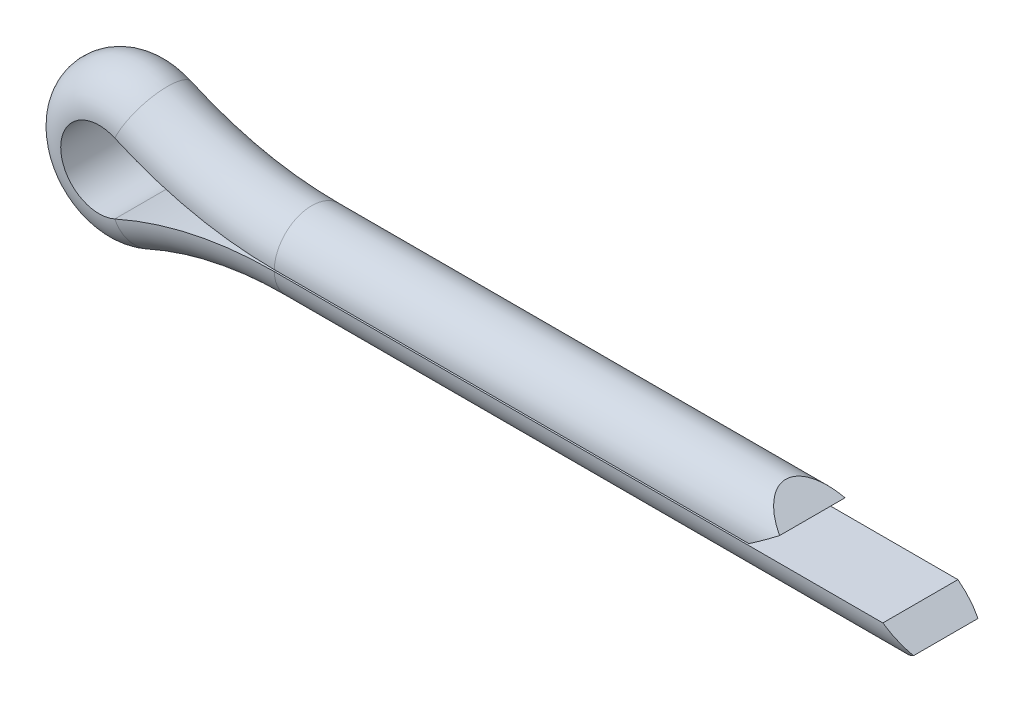
ISO-10303-21;
HEADER;
FILE_DESCRIPTION(('STEP AP214'),'2;1');
FILE_NAME('part.step','',(''),(''),'','','');
FILE_SCHEMA(('AUTOMOTIVE_DESIGN { 1 0 10303 214 1 1 1 1 }'));
ENDSEC;
DATA;
#1=APPLICATION_CONTEXT('core data for automotive mechanical design processes');
#2=APPLICATION_PROTOCOL_DEFINITION('international standard','automotive_design',2000,#1);
#3=PRODUCT_CONTEXT('',#1,'mechanical');
#4=PRODUCT('Part','Part','',(#3));
#5=PRODUCT_RELATED_PRODUCT_CATEGORY('part','',(#4));
#6=PRODUCT_DEFINITION_FORMATION('','',#4);
#7=PRODUCT_DEFINITION_CONTEXT('part definition',#1,'design');
#8=PRODUCT_DEFINITION('design','',#6,#7);
#9=PRODUCT_DEFINITION_SHAPE('','',#8);
#10=(LENGTH_UNIT() NAMED_UNIT(*) SI_UNIT(.MILLI.,.METRE.));
#11=(NAMED_UNIT(*) PLANE_ANGLE_UNIT() SI_UNIT($,.RADIAN.));
#12=(NAMED_UNIT(*) SI_UNIT($,.STERADIAN.) SOLID_ANGLE_UNIT());
#13=UNCERTAINTY_MEASURE_WITH_UNIT(LENGTH_MEASURE(1.E-05),#10,'distance_accuracy_value','');
#14=(GEOMETRIC_REPRESENTATION_CONTEXT(3) GLOBAL_UNCERTAINTY_ASSIGNED_CONTEXT((#13)) GLOBAL_UNIT_ASSIGNED_CONTEXT((#10,
#11,#12)) REPRESENTATION_CONTEXT('',''));
#15=CARTESIAN_POINT('',(0.,0.,0.));
#16=DIRECTION('',(0.,0.,1.));
#17=DIRECTION('',(1.,0.,0.));
#18=AXIS2_PLACEMENT_3D('',#15,#16,#17);
#19=CARTESIAN_POINT('',(2.10000000000001,0.,0.));
#20=DIRECTION('',(1.,0.,0.));
#21=DIRECTION('',(0.,1.,0.));
#22=AXIS2_PLACEMENT_3D('',#19,#20,#21);
#23=CYLINDRICAL_SURFACE('',#22,0.45);
#24=CARTESIAN_POINT('',(9.38216773617407,0.,0.));
#25=DIRECTION('',(-0.586251612404128,-0.81012903105219,0.));
#26=DIRECTION('',(0.81012903105219,-0.586251612404128,0.));
#27=AXIS2_PLACEMENT_3D('',#24,#25,#26);
#28=ELLIPSE('',#27,0.767588507184857,0.45);
#29=CARTESIAN_POINT('',(9.7,-0.23,-0.386781592116268));
#30=VERTEX_POINT('',#29);
#31=CARTESIAN_POINT('',(9.39598653025346,-0.0100000000000006,-0.44988887516808));
#32=VERTEX_POINT('',#31);
#33=EDGE_CURVE('E175',#30,#32,#28,.F.);
#34=ORIENTED_EDGE('',*,*,#33,.F.);
#35=CARTESIAN_POINT('',(10.0395995364447,0.,0.));
#36=DIRECTION('',(-0.560762411864817,0.827976761412754,0.));
#37=DIRECTION('',(0.827976761412754,0.560762411864818,0.));
#38=AXIS2_PLACEMENT_3D('',#35,#36,#37);
#39=ELLIPSE('',#38,0.802478893875079,0.45);
#40=CARTESIAN_POINT('',(9.7,-0.23,0.386781592116267));
#41=VERTEX_POINT('',#40);
#42=EDGE_CURVE('E171',#41,#30,#39,.F.);
#43=ORIENTED_EDGE('',*,*,#42,.F.);
#44=CARTESIAN_POINT('',(9.39598653025346,-0.0100000000000001,0.44988887516808));
#45=VERTEX_POINT('',#44);
#46=EDGE_CURVE('E118',#45,#41,#28,.F.);
#47=ORIENTED_EDGE('',*,*,#46,.F.);
#48=DIRECTION('',(1.,0.,0.));
#49=VECTOR('',#48,1.);
#50=CARTESIAN_POINT('',(2.10000000000001,-0.00999999999999997,0.44988887516808));
#51=LINE('',#50,#49);
#52=CARTESIAN_POINT('',(2.10000000000001,-0.00999999999999997,0.44988887516808));
#53=VERTEX_POINT('',#52);
#54=EDGE_CURVE('E46',#53,#45,#51,.T.);
#55=ORIENTED_EDGE('',*,*,#54,.F.);
#56=CARTESIAN_POINT('',(2.10000000000001,0.,0.));
#57=DIRECTION('',(1.,0.,0.));
#58=DIRECTION('',(0.,0.,1.));
#59=AXIS2_PLACEMENT_3D('',#56,#57,#58);
#60=CIRCLE('',#59,0.45);
#61=CARTESIAN_POINT('',(2.10000000000001,-0.00999999999999997,-0.44988887516808));
#62=VERTEX_POINT('',#61);
#63=EDGE_CURVE('E153',#53,#62,#60,.T.);
#64=ORIENTED_EDGE('',*,*,#63,.T.);
#65=DIRECTION('',(1.,0.,0.));
#66=VECTOR('',#65,1.);
#67=CARTESIAN_POINT('',(2.10000000000001,-0.00999999999999997,-0.44988887516808));
#68=LINE('',#67,#66);
#69=EDGE_CURVE('E11',#62,#32,#68,.T.);
#70=ORIENTED_EDGE('',*,*,#69,.T.);
#71=EDGE_LOOP('',(#34,#43,#47,#55,#64,#70));
#72=FACE_BOUND('',#71,.T.);
#73=ADVANCED_FACE('F38',(#72),#23,.T.);
#74=CARTESIAN_POINT('',(2.10000000000001,-0.00999999999999997,-0.44988887516808));
#75=DIRECTION('',(0.,1.,0.));
#76=DIRECTION('',(-1.,0.,0.));
#77=AXIS2_PLACEMENT_3D('',#74,#75,#76);
#78=PLANE('',#77);
#79=DIRECTION('',(0.,0.,1.));
#80=VECTOR('',#79,1.);
#81=CARTESIAN_POINT('',(9.39598653025346,-0.0100000000000001,-0.44988887516808));
#82=LINE('',#81,#80);
#83=EDGE_CURVE('E53',#32,#45,#82,.T.);
#84=ORIENTED_EDGE('',*,*,#83,.F.);
#85=ORIENTED_EDGE('',*,*,#69,.F.);
#86=DIRECTION('',(0.,0.,1.));
#87=VECTOR('',#86,1.);
#88=CARTESIAN_POINT('',(2.10000000000001,-0.00999999999999997,-0.44988887516808));
#89=LINE('',#88,#87);
#90=EDGE_CURVE('E156',#62,#53,#89,.T.);
#91=ORIENTED_EDGE('',*,*,#90,.T.);
#92=ORIENTED_EDGE('',*,*,#54,.T.);
#93=EDGE_LOOP('',(#84,#85,#91,#92));
#94=FACE_BOUND('',#93,.T.);
#95=ADVANCED_FACE('F40',(#94),#78,.T.);
#96=CARTESIAN_POINT('',(2.1,-4.675,0.));
#97=DIRECTION('',(0.,0.,-1.));
#98=DIRECTION('',(-1.,0.,0.));
#99=AXIS2_PLACEMENT_3D('',#96,#97,#98);
#100=CYLINDRICAL_SURFACE('',#99,4.665);
#101=DIRECTION('',(0.,0.,1.));
#102=VECTOR('',#101,1.);
#103=CARTESIAN_POINT('',(0.188487804878055,-0.419609756097559,-0.44988887516808));
#104=LINE('',#103,#102);
#105=CARTESIAN_POINT('',(0.188487804878055,-0.419609756097559,-0.44988887516808));
#106=VERTEX_POINT('',#105);
#107=CARTESIAN_POINT('',(0.188487804878055,-0.419609756097559,0.44988887516808));
#108=VERTEX_POINT('',#107);
#109=EDGE_CURVE('E144',#106,#108,#104,.T.);
#110=ORIENTED_EDGE('',*,*,#109,.T.);
#111=CARTESIAN_POINT('',(2.1,-4.675,0.44988887516808));
#112=DIRECTION('',(0.,0.,-1.));
#113=DIRECTION('',(-1.,0.,0.));
#114=AXIS2_PLACEMENT_3D('',#111,#112,#113);
#115=CIRCLE('',#114,4.665);
#116=EDGE_CURVE('E159',#108,#53,#115,.T.);
#117=ORIENTED_EDGE('',*,*,#116,.T.);
#118=ORIENTED_EDGE('',*,*,#90,.F.);
#119=CARTESIAN_POINT('',(2.1,-4.675,-0.44988887516808));
#120=DIRECTION('',(0.,0.,-1.));
#121=DIRECTION('',(-1.,0.,0.));
#122=AXIS2_PLACEMENT_3D('',#119,#120,#121);
#123=CIRCLE('',#122,4.665);
#124=EDGE_CURVE('E162',#106,#62,#123,.T.);
#125=ORIENTED_EDGE('',*,*,#124,.F.);
#126=EDGE_LOOP('',(#110,#117,#118,#125));
#127=FACE_BOUND('',#126,.T.);
#128=ADVANCED_FACE('F195',(#127),#100,.T.);
#129=CARTESIAN_POINT('',(2.1,-4.675,0.));
#130=DIRECTION('',(0.,0.,-1.));
#131=DIRECTION('',(-1.,0.,0.));
#132=AXIS2_PLACEMENT_3D('',#129,#130,#131);
#133=TOROIDAL_SURFACE('',#132,4.675,0.45);
#134=CARTESIAN_POINT('',(0.184390243902445,-0.410487804878047,0.));
#135=DIRECTION('',(0.912195121951213,0.409756097560989,0.));
#136=DIRECTION('',(0.,0.,1.));
#137=AXIS2_PLACEMENT_3D('',#134,#135,#136);
#138=CIRCLE('',#137,0.45);
#139=EDGE_CURVE('E141',#108,#106,#138,.T.);
#140=ORIENTED_EDGE('',*,*,#139,.T.);
#141=ORIENTED_EDGE('',*,*,#124,.T.);
#142=ORIENTED_EDGE('',*,*,#63,.F.);
#143=ORIENTED_EDGE('',*,*,#116,.F.);
#144=EDGE_LOOP('',(#140,#141,#142,#143));
#145=FACE_BOUND('',#144,.T.);
#146=ADVANCED_FACE('F197',(#145),#133,.T.);
#147=CARTESIAN_POINT('',(0.,0.,0.));
#148=DIRECTION('',(0.,0.,1.));
#149=DIRECTION('',(1.,0.,0.));
#150=AXIS2_PLACEMENT_3D('',#147,#148,#149);
#151=CYLINDRICAL_SURFACE('',#150,0.460000000000001);
#152=DIRECTION('',(0.,0.,1.));
#153=VECTOR('',#152,1.);
#154=CARTESIAN_POINT('',(0.18848780487805,0.419609756097561,-0.44988887516808));
#155=LINE('',#154,#153);
#156=CARTESIAN_POINT('',(0.18848780487805,0.419609756097561,-0.44988887516808));
#157=VERTEX_POINT('',#156);
#158=CARTESIAN_POINT('',(0.18848780487805,0.419609756097561,0.44988887516808));
#159=VERTEX_POINT('',#158);
#160=EDGE_CURVE('E128',#157,#159,#155,.T.);
#161=ORIENTED_EDGE('',*,*,#160,.T.);
#162=CARTESIAN_POINT('',(0.,0.,0.44988887516808));
#163=DIRECTION('',(0.,0.,1.));
#164=DIRECTION('',(1.,0.,0.));
#165=AXIS2_PLACEMENT_3D('',#162,#163,#164);
#166=CIRCLE('',#165,0.460000000000001);
#167=EDGE_CURVE('E147',#159,#108,#166,.T.);
#168=ORIENTED_EDGE('',*,*,#167,.T.);
#169=ORIENTED_EDGE('',*,*,#109,.F.);
#170=CARTESIAN_POINT('',(0.,0.,-0.44988887516808));
#171=DIRECTION('',(0.,0.,1.));
#172=DIRECTION('',(1.,0.,0.));
#173=AXIS2_PLACEMENT_3D('',#170,#171,#172);
#174=CIRCLE('',#173,0.460000000000001);
#175=EDGE_CURVE('E150',#157,#106,#174,.T.);
#176=ORIENTED_EDGE('',*,*,#175,.F.);
#177=EDGE_LOOP('',(#161,#168,#169,#176));
#178=FACE_BOUND('',#177,.T.);
#179=ADVANCED_FACE('F192',(#178),#151,.F.);
#180=CARTESIAN_POINT('',(0.,0.,0.));
#181=DIRECTION('',(0.,0.,1.));
#182=DIRECTION('',(1.,0.,0.));
#183=AXIS2_PLACEMENT_3D('',#180,#181,#182);
#184=TOROIDAL_SURFACE('',#183,0.45,0.45);
#185=CARTESIAN_POINT('',(0.18439024390244,0.410487804878049,0.));
#186=DIRECTION('',(-0.912195121951219,0.409756097560976,0.));
#187=DIRECTION('',(0.,0.,1.));
#188=AXIS2_PLACEMENT_3D('',#185,#186,#187);
#189=CIRCLE('',#188,0.45);
#190=EDGE_CURVE('E124',#159,#157,#189,.T.);
#191=ORIENTED_EDGE('',*,*,#190,.T.);
#192=ORIENTED_EDGE('',*,*,#175,.T.);
#193=ORIENTED_EDGE('',*,*,#139,.F.);
#194=ORIENTED_EDGE('',*,*,#167,.F.);
#195=EDGE_LOOP('',(#191,#192,#193,#194));
#196=FACE_BOUND('',#195,.T.);
#197=ADVANCED_FACE('F189',(#196),#184,.T.);
#198=CARTESIAN_POINT('',(2.1,4.675,0.));
#199=DIRECTION('',(0.,0.,-1.));
#200=DIRECTION('',(-1.,0.,0.));
#201=AXIS2_PLACEMENT_3D('',#198,#199,#200);
#202=CYLINDRICAL_SURFACE('',#201,4.665);
#203=DIRECTION('',(0.,0.,1.));
#204=VECTOR('',#203,1.);
#205=CARTESIAN_POINT('',(2.1,0.01,-0.44988887516808));
#206=LINE('',#205,#204);
#207=CARTESIAN_POINT('',(2.1,0.01,-0.44988887516808));
#208=VERTEX_POINT('',#207);
#209=CARTESIAN_POINT('',(2.1,0.01,0.44988887516808));
#210=VERTEX_POINT('',#209);
#211=EDGE_CURVE('E123',#208,#210,#206,.T.);
#212=ORIENTED_EDGE('',*,*,#211,.T.);
#213=CARTESIAN_POINT('',(2.1,4.675,0.44988887516808));
#214=DIRECTION('',(0.,0.,-1.));
#215=DIRECTION('',(-1.,0.,0.));
#216=AXIS2_PLACEMENT_3D('',#213,#214,#215);
#217=CIRCLE('',#216,4.665);
#218=EDGE_CURVE('E135',#210,#159,#217,.T.);
#219=ORIENTED_EDGE('',*,*,#218,.T.);
#220=ORIENTED_EDGE('',*,*,#160,.F.);
#221=CARTESIAN_POINT('',(2.1,4.675,-0.44988887516808));
#222=DIRECTION('',(0.,0.,-1.));
#223=DIRECTION('',(-1.,0.,0.));
#224=AXIS2_PLACEMENT_3D('',#221,#222,#223);
#225=CIRCLE('',#224,4.665);
#226=EDGE_CURVE('E138',#208,#157,#225,.T.);
#227=ORIENTED_EDGE('',*,*,#226,.F.);
#228=EDGE_LOOP('',(#212,#219,#220,#227));
#229=FACE_BOUND('',#228,.T.);
#230=ADVANCED_FACE('F183',(#229),#202,.T.);
#231=CARTESIAN_POINT('',(2.1,4.675,0.));
#232=DIRECTION('',(0.,0.,-1.));
#233=DIRECTION('',(-1.,0.,0.));
#234=AXIS2_PLACEMENT_3D('',#231,#232,#233);
#235=TOROIDAL_SURFACE('',#234,4.675,0.45);
#236=CARTESIAN_POINT('',(2.1,0.,0.));
#237=DIRECTION('',(-1.,0.,0.));
#238=DIRECTION('',(0.,0.,1.));
#239=AXIS2_PLACEMENT_3D('',#236,#237,#238);
#240=CIRCLE('',#239,0.45);
#241=EDGE_CURVE('E177',#210,#208,#240,.T.);
#242=ORIENTED_EDGE('',*,*,#241,.T.);
#243=ORIENTED_EDGE('',*,*,#226,.T.);
#244=ORIENTED_EDGE('',*,*,#190,.F.);
#245=ORIENTED_EDGE('',*,*,#218,.F.);
#246=EDGE_LOOP('',(#242,#243,#244,#245));
#247=FACE_BOUND('',#246,.T.);
#248=ADVANCED_FACE('F186',(#247),#235,.T.);
#249=CARTESIAN_POINT('',(2.1,0.,0.));
#250=DIRECTION('',(1.,0.,0.));
#251=DIRECTION('',(0.,1.,0.));
#252=AXIS2_PLACEMENT_3D('',#249,#250,#251);
#253=CYLINDRICAL_SURFACE('',#252,0.45);
#254=DIRECTION('',(1.,0.,0.));
#255=VECTOR('',#254,1.);
#256=CARTESIAN_POINT('',(2.1,0.01,0.44988887516808));
#257=LINE('',#256,#255);
#258=CARTESIAN_POINT('',(7.7899308580287,0.0100000000000001,0.44988887516808));
#259=VERTEX_POINT('',#258);
#260=EDGE_CURVE('E125',#210,#259,#257,.T.);
#261=ORIENTED_EDGE('',*,*,#260,.T.);
#262=CARTESIAN_POINT('',(7.77516566079198,0.,0.));
#263=DIRECTION('',(-0.560762411864818,0.827976761412754,0.));
#264=DIRECTION('',(0.827976761412754,0.560762411864818,0.));
#265=AXIS2_PLACEMENT_3D('',#262,#263,#264);
#266=ELLIPSE('',#265,0.802478893875078,0.45);
#267=CARTESIAN_POINT('',(8.1,0.22,0.39255572852781));
#268=VERTEX_POINT('',#267);
#269=EDGE_CURVE('E61',#259,#268,#266,.T.);
#270=ORIENTED_EDGE('',*,*,#269,.T.);
#271=CARTESIAN_POINT('',(8.40401346974654,0.,0.));
#272=DIRECTION('',(-0.586251612404127,-0.81012903105219,0.));
#273=DIRECTION('',(0.81012903105219,-0.586251612404127,0.));
#274=AXIS2_PLACEMENT_3D('',#271,#272,#273);
#275=ELLIPSE('',#274,0.767588507184858,0.45);
#276=CARTESIAN_POINT('',(8.1,0.22,-0.39255572852781));
#277=VERTEX_POINT('',#276);
#278=EDGE_CURVE('E111',#268,#277,#275,.T.);
#279=ORIENTED_EDGE('',*,*,#278,.T.);
#280=CARTESIAN_POINT('',(7.7899308580287,0.00999999999999981,-0.44988887516808));
#281=VERTEX_POINT('',#280);
#282=EDGE_CURVE('E105',#277,#281,#266,.T.);
#283=ORIENTED_EDGE('',*,*,#282,.T.);
#284=DIRECTION('',(1.,0.,0.));
#285=VECTOR('',#284,1.);
#286=CARTESIAN_POINT('',(2.1,0.01,-0.44988887516808));
#287=LINE('',#286,#285);
#288=EDGE_CURVE('E117',#208,#281,#287,.T.);
#289=ORIENTED_EDGE('',*,*,#288,.F.);
#290=ORIENTED_EDGE('',*,*,#241,.F.);
#291=EDGE_LOOP('',(#261,#270,#279,#283,#289,#290));
#292=FACE_BOUND('',#291,.T.);
#293=ADVANCED_FACE('F115',(#292),#253,.T.);
#294=CARTESIAN_POINT('',(2.1,0.01,-0.44988887516808));
#295=DIRECTION('',(0.,1.,0.));
#296=DIRECTION('',(-1.,0.,0.));
#297=AXIS2_PLACEMENT_3D('',#294,#295,#296);
#298=PLANE('',#297);
#299=ORIENTED_EDGE('',*,*,#288,.T.);
#300=DIRECTION('',(0.,0.,1.));
#301=VECTOR('',#300,1.);
#302=CARTESIAN_POINT('',(7.7899308580287,0.0100000000000001,-0.44988887516808));
#303=LINE('',#302,#301);
#304=EDGE_CURVE('E102',#281,#259,#303,.T.);
#305=ORIENTED_EDGE('',*,*,#304,.T.);
#306=ORIENTED_EDGE('',*,*,#260,.F.);
#307=ORIENTED_EDGE('',*,*,#211,.F.);
#308=EDGE_LOOP('',(#299,#305,#306,#307));
#309=FACE_BOUND('',#308,.T.);
#310=ADVANCED_FACE('F121',(#309),#298,.F.);
#311=CARTESIAN_POINT('',(8.1,0.22,-0.44988887516808));
#312=DIRECTION('',(-0.560762411864818,0.827976761412754,0.));
#313=DIRECTION('',(-0.827976761412754,-0.560762411864818,0.));
#314=AXIS2_PLACEMENT_3D('',#311,#312,#313);
#315=PLANE('',#314);
#316=DIRECTION('',(0.,0.,1.));
#317=VECTOR('',#316,1.);
#318=CARTESIAN_POINT('',(8.1,0.22,-0.44988887516808));
#319=LINE('',#318,#317);
#320=EDGE_CURVE('E340',#277,#268,#319,.T.);
#321=ORIENTED_EDGE('',*,*,#320,.T.);
#322=ORIENTED_EDGE('',*,*,#269,.F.);
#323=ORIENTED_EDGE('',*,*,#304,.F.);
#324=ORIENTED_EDGE('',*,*,#282,.F.);
#325=EDGE_LOOP('',(#321,#322,#323,#324));
#326=FACE_BOUND('',#325,.T.);
#327=ADVANCED_FACE('F104',(#326),#315,.F.);
#328=CARTESIAN_POINT('',(8.1,0.22,-0.44988887516808));
#329=DIRECTION('',(-0.586251612404127,-0.81012903105219,0.));
#330=DIRECTION('',(0.81012903105219,-0.586251612404127,0.));
#331=AXIS2_PLACEMENT_3D('',#328,#329,#330);
#332=PLANE('',#331);
#333=ORIENTED_EDGE('',*,*,#320,.F.);
#334=ORIENTED_EDGE('',*,*,#278,.F.);
#335=EDGE_LOOP('',(#333,#334));
#336=FACE_BOUND('',#335,.T.);
#337=ADVANCED_FACE('F278',(#336),#332,.F.);
#338=CARTESIAN_POINT('',(9.7,-0.23,-0.44988887516808));
#339=DIRECTION('',(-0.560762411864817,0.827976761412754,0.));
#340=DIRECTION('',(-0.827976761412754,-0.560762411864818,0.));
#341=AXIS2_PLACEMENT_3D('',#338,#339,#340);
#342=PLANE('',#341);
#343=ORIENTED_EDGE('',*,*,#42,.T.);
#344=DIRECTION('',(0.,0.,1.));
#345=VECTOR('',#344,1.);
#346=CARTESIAN_POINT('',(9.7,-0.23,-0.44988887516808));
#347=LINE('',#346,#345);
#348=EDGE_CURVE('E341',#30,#41,#347,.T.);
#349=ORIENTED_EDGE('',*,*,#348,.T.);
#350=EDGE_LOOP('',(#343,#349));
#351=FACE_BOUND('',#350,.T.);
#352=ADVANCED_FACE('F287',(#351),#342,.F.);
#353=CARTESIAN_POINT('',(9.7,-0.23,-0.44988887516808));
#354=DIRECTION('',(-0.586251612404128,-0.81012903105219,0.));
#355=DIRECTION('',(0.81012903105219,-0.586251612404128,0.));
#356=AXIS2_PLACEMENT_3D('',#353,#354,#355);
#357=PLANE('',#356);
#358=ORIENTED_EDGE('',*,*,#33,.T.);
#359=ORIENTED_EDGE('',*,*,#83,.T.);
#360=ORIENTED_EDGE('',*,*,#46,.T.);
#361=ORIENTED_EDGE('',*,*,#348,.F.);
#362=EDGE_LOOP('',(#358,#359,#360,#361));
#363=FACE_BOUND('',#362,.T.);
#364=ADVANCED_FACE('F297',(#363),#357,.F.);
#365=CLOSED_SHELL('',(#73,#95,#128,#146,#179,#197,#230,#248,#293,#310,#327,#337,#352,#364));
#366=MANIFOLD_SOLID_BREP('B2',#365);
#367=ADVANCED_BREP_SHAPE_REPRESENTATION('',(#18,#366),#14);
#368=SHAPE_DEFINITION_REPRESENTATION(#9,#367);
ENDSEC;
END-ISO-10303-21;
